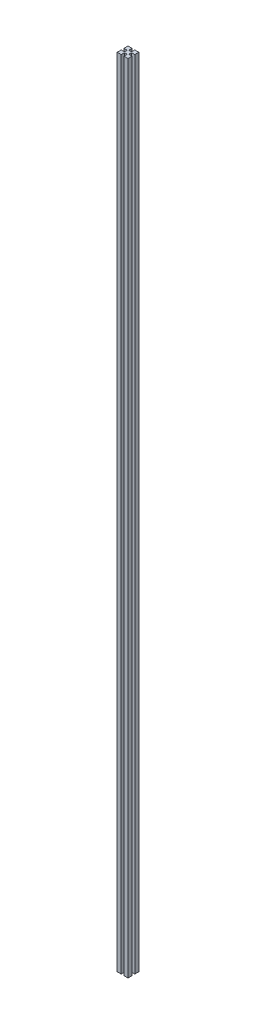
ISO-10303-21;
HEADER;
FILE_DESCRIPTION(('STEP AP214'),'2;1');
FILE_NAME('part.step','',(''),(''),'','','');
FILE_SCHEMA(('AUTOMOTIVE_DESIGN { 1 0 10303 214 1 1 1 1 }'));
ENDSEC;
DATA;
#1=APPLICATION_CONTEXT('core data for automotive mechanical design processes');
#2=APPLICATION_PROTOCOL_DEFINITION('international standard','automotive_design',2000,#1);
#3=PRODUCT_CONTEXT('',#1,'mechanical');
#4=PRODUCT('Part','Part','',(#3));
#5=PRODUCT_RELATED_PRODUCT_CATEGORY('part','',(#4));
#6=PRODUCT_DEFINITION_FORMATION('','',#4);
#7=PRODUCT_DEFINITION_CONTEXT('part definition',#1,'design');
#8=PRODUCT_DEFINITION('design','',#6,#7);
#9=PRODUCT_DEFINITION_SHAPE('','',#8);
#10=(LENGTH_UNIT() NAMED_UNIT(*) SI_UNIT(.MILLI.,.METRE.));
#11=(NAMED_UNIT(*) PLANE_ANGLE_UNIT() SI_UNIT($,.RADIAN.));
#12=(NAMED_UNIT(*) SI_UNIT($,.STERADIAN.) SOLID_ANGLE_UNIT());
#13=UNCERTAINTY_MEASURE_WITH_UNIT(LENGTH_MEASURE(1.E-05),#10,'distance_accuracy_value','');
#14=(GEOMETRIC_REPRESENTATION_CONTEXT(3) GLOBAL_UNCERTAINTY_ASSIGNED_CONTEXT((#13)) GLOBAL_UNIT_ASSIGNED_CONTEXT((#10,
#11,#12)) REPRESENTATION_CONTEXT('',''));
#15=CARTESIAN_POINT('',(0.,0.,0.));
#16=DIRECTION('',(0.,0.,1.));
#17=DIRECTION('',(1.,0.,0.));
#18=AXIS2_PLACEMENT_3D('',#15,#16,#17);
#19=CARTESIAN_POINT('',(10.,-736.6,10.));
#20=DIRECTION('',(1.,0.,0.));
#21=DIRECTION('',(0.,0.,-1.));
#22=AXIS2_PLACEMENT_3D('',#19,#20,#21);
#23=PLANE('',#22);
#24=DIRECTION('',(0.,-1.,0.));
#25=VECTOR('',#24,1.);
#26=CARTESIAN_POINT('',(10.,-736.6,2.5));
#27=LINE('',#26,#25);
#28=CARTESIAN_POINT('',(10.,736.6,2.5));
#29=VERTEX_POINT('',#28);
#30=CARTESIAN_POINT('',(10.,-736.6,2.5));
#31=VERTEX_POINT('',#30);
#32=EDGE_CURVE('E263',#29,#31,#27,.T.);
#33=ORIENTED_EDGE('',*,*,#32,.F.);
#34=DIRECTION('',(0.,0.,-1.));
#35=VECTOR('',#34,1.);
#36=CARTESIAN_POINT('',(10.,736.6,10.));
#37=LINE('',#36,#35);
#38=CARTESIAN_POINT('',(10.,736.6,10.));
#39=VERTEX_POINT('',#38);
#40=EDGE_CURVE('E269',#39,#29,#37,.T.);
#41=ORIENTED_EDGE('',*,*,#40,.F.);
#42=DIRECTION('',(0.,1.,0.));
#43=VECTOR('',#42,1.);
#44=CARTESIAN_POINT('',(10.,-736.6,10.));
#45=LINE('',#44,#43);
#46=CARTESIAN_POINT('',(10.,-736.6,10.));
#47=VERTEX_POINT('',#46);
#48=EDGE_CURVE('E300',#47,#39,#45,.T.);
#49=ORIENTED_EDGE('',*,*,#48,.F.);
#50=DIRECTION('',(0.,0.,-1.));
#51=VECTOR('',#50,1.);
#52=CARTESIAN_POINT('',(10.,-736.6,10.));
#53=LINE('',#52,#51);
#54=EDGE_CURVE('E284',#47,#31,#53,.T.);
#55=ORIENTED_EDGE('',*,*,#54,.T.);
#56=EDGE_LOOP('',(#33,#41,#49,#55));
#57=FACE_BOUND('',#56,.T.);
#58=ADVANCED_FACE('F32',(#57),#23,.T.);
#59=CARTESIAN_POINT('',(-10.,-736.6,10.));
#60=DIRECTION('',(0.,0.,1.));
#61=DIRECTION('',(1.,0.,0.));
#62=AXIS2_PLACEMENT_3D('',#59,#60,#61);
#63=PLANE('',#62);
#64=DIRECTION('',(0.,1.,0.));
#65=VECTOR('',#64,1.);
#66=CARTESIAN_POINT('',(2.50000000000001,-736.6,10.));
#67=LINE('',#66,#65);
#68=CARTESIAN_POINT('',(2.50000000000001,-736.6,10.));
#69=VERTEX_POINT('',#68);
#70=CARTESIAN_POINT('',(2.50000000000001,736.6,10.));
#71=VERTEX_POINT('',#70);
#72=EDGE_CURVE('E256',#69,#71,#67,.T.);
#73=ORIENTED_EDGE('',*,*,#72,.F.);
#74=DIRECTION('',(1.,0.,0.));
#75=VECTOR('',#74,1.);
#76=CARTESIAN_POINT('',(-10.,-736.6,10.));
#77=LINE('',#76,#75);
#78=EDGE_CURVE('E295',#69,#47,#77,.T.);
#79=ORIENTED_EDGE('',*,*,#78,.T.);
#80=ORIENTED_EDGE('',*,*,#48,.T.);
#81=DIRECTION('',(1.,0.,0.));
#82=VECTOR('',#81,1.);
#83=CARTESIAN_POINT('',(-10.,736.6,10.));
#84=LINE('',#83,#82);
#85=EDGE_CURVE('E279',#71,#39,#84,.T.);
#86=ORIENTED_EDGE('',*,*,#85,.F.);
#87=EDGE_LOOP('',(#73,#79,#80,#86));
#88=FACE_BOUND('',#87,.T.);
#89=ADVANCED_FACE('F374',(#88),#63,.T.);
#90=CARTESIAN_POINT('',(-10.,-736.6,10.));
#91=DIRECTION('',(-1.,0.,0.));
#92=DIRECTION('',(0.,0.,1.));
#93=AXIS2_PLACEMENT_3D('',#90,#91,#92);
#94=PLANE('',#93);
#95=DIRECTION('',(0.,-1.,0.));
#96=VECTOR('',#95,1.);
#97=CARTESIAN_POINT('',(-10.,-736.6,-2.50000000000001));
#98=LINE('',#97,#96);
#99=CARTESIAN_POINT('',(-10.,736.6,-2.50000000000001));
#100=VERTEX_POINT('',#99);
#101=CARTESIAN_POINT('',(-10.,-736.6,-2.50000000000001));
#102=VERTEX_POINT('',#101);
#103=EDGE_CURVE('E259',#100,#102,#98,.T.);
#104=ORIENTED_EDGE('',*,*,#103,.F.);
#105=DIRECTION('',(0.,0.,1.));
#106=VECTOR('',#105,1.);
#107=CARTESIAN_POINT('',(-10.,736.6,10.));
#108=LINE('',#107,#106);
#109=CARTESIAN_POINT('',(-10.,736.6,-10.));
#110=VERTEX_POINT('',#109);
#111=EDGE_CURVE('E276',#110,#100,#108,.T.);
#112=ORIENTED_EDGE('',*,*,#111,.F.);
#113=DIRECTION('',(0.,1.,0.));
#114=VECTOR('',#113,1.);
#115=CARTESIAN_POINT('',(-10.,-736.6,-10.));
#116=LINE('',#115,#114);
#117=CARTESIAN_POINT('',(-10.,-736.6,-10.));
#118=VERTEX_POINT('',#117);
#119=EDGE_CURVE('E307',#118,#110,#116,.T.);
#120=ORIENTED_EDGE('',*,*,#119,.F.);
#121=DIRECTION('',(0.,0.,1.));
#122=VECTOR('',#121,1.);
#123=CARTESIAN_POINT('',(-10.,-736.6,10.));
#124=LINE('',#123,#122);
#125=EDGE_CURVE('E292',#118,#102,#124,.T.);
#126=ORIENTED_EDGE('',*,*,#125,.T.);
#127=EDGE_LOOP('',(#104,#112,#120,#126));
#128=FACE_BOUND('',#127,.T.);
#129=ADVANCED_FACE('F344',(#128),#94,.T.);
#130=CARTESIAN_POINT('',(-10.,-736.6,-10.));
#131=DIRECTION('',(0.,0.,-1.));
#132=DIRECTION('',(-1.,0.,0.));
#133=AXIS2_PLACEMENT_3D('',#130,#131,#132);
#134=PLANE('',#133);
#135=DIRECTION('',(0.,-1.,0.));
#136=VECTOR('',#135,1.);
#137=CARTESIAN_POINT('',(2.5,-736.6,-10.));
#138=LINE('',#137,#136);
#139=CARTESIAN_POINT('',(2.5,736.6,-10.));
#140=VERTEX_POINT('',#139);
#141=CARTESIAN_POINT('',(2.5,-736.6,-10.));
#142=VERTEX_POINT('',#141);
#143=EDGE_CURVE('E266',#140,#142,#138,.T.);
#144=ORIENTED_EDGE('',*,*,#143,.F.);
#145=DIRECTION('',(-1.,0.,0.));
#146=VECTOR('',#145,1.);
#147=CARTESIAN_POINT('',(-10.,736.6,-10.));
#148=LINE('',#147,#146);
#149=CARTESIAN_POINT('',(10.,736.6,-10.));
#150=VERTEX_POINT('',#149);
#151=EDGE_CURVE('E273',#150,#140,#148,.T.);
#152=ORIENTED_EDGE('',*,*,#151,.F.);
#153=DIRECTION('',(0.,1.,0.));
#154=VECTOR('',#153,1.);
#155=CARTESIAN_POINT('',(10.,-736.6,-10.));
#156=LINE('',#155,#154);
#157=CARTESIAN_POINT('',(10.,-736.6,-10.));
#158=VERTEX_POINT('',#157);
#159=EDGE_CURVE('E299',#158,#150,#156,.T.);
#160=ORIENTED_EDGE('',*,*,#159,.F.);
#161=DIRECTION('',(-1.,0.,0.));
#162=VECTOR('',#161,1.);
#163=CARTESIAN_POINT('',(-10.,-736.6,-10.));
#164=LINE('',#163,#162);
#165=EDGE_CURVE('E288',#158,#142,#164,.T.);
#166=ORIENTED_EDGE('',*,*,#165,.T.);
#167=EDGE_LOOP('',(#144,#152,#160,#166));
#168=FACE_BOUND('',#167,.T.);
#169=ADVANCED_FACE('F328',(#168),#134,.T.);
#170=DIRECTION('',(0.,1.,0.));
#171=VECTOR('',#170,1.);
#172=CARTESIAN_POINT('',(10.,-736.6,-2.5));
#173=LINE('',#172,#171);
#174=CARTESIAN_POINT('',(10.,-736.6,-2.5));
#175=VERTEX_POINT('',#174);
#176=CARTESIAN_POINT('',(10.,736.6,-2.5));
#177=VERTEX_POINT('',#176);
#178=EDGE_CURVE('E261',#175,#177,#173,.T.);
#179=ORIENTED_EDGE('',*,*,#178,.F.);
#180=EDGE_CURVE('E283',#175,#158,#53,.T.);
#181=ORIENTED_EDGE('',*,*,#180,.T.);
#182=ORIENTED_EDGE('',*,*,#159,.T.);
#183=EDGE_CURVE('E268',#177,#150,#37,.T.);
#184=ORIENTED_EDGE('',*,*,#183,.F.);
#185=EDGE_LOOP('',(#179,#181,#182,#184));
#186=FACE_BOUND('',#185,.T.);
#187=ADVANCED_FACE('F34',(#186),#23,.T.);
#188=DIRECTION('',(0.,-1.,0.));
#189=VECTOR('',#188,1.);
#190=CARTESIAN_POINT('',(-2.49999999999999,-736.6,10.));
#191=LINE('',#190,#189);
#192=CARTESIAN_POINT('',(-2.49999999999999,736.6,10.));
#193=VERTEX_POINT('',#192);
#194=CARTESIAN_POINT('',(-2.49999999999999,-736.6,10.));
#195=VERTEX_POINT('',#194);
#196=EDGE_CURVE('E200',#193,#195,#191,.T.);
#197=ORIENTED_EDGE('',*,*,#196,.F.);
#198=CARTESIAN_POINT('',(-10.,736.6,10.));
#199=VERTEX_POINT('',#198);
#200=EDGE_CURVE('E280',#199,#193,#84,.T.);
#201=ORIENTED_EDGE('',*,*,#200,.F.);
#202=DIRECTION('',(0.,1.,0.));
#203=VECTOR('',#202,1.);
#204=CARTESIAN_POINT('',(-10.,-736.6,10.));
#205=LINE('',#204,#203);
#206=CARTESIAN_POINT('',(-10.,-736.6,10.));
#207=VERTEX_POINT('',#206);
#208=EDGE_CURVE('E304',#207,#199,#205,.T.);
#209=ORIENTED_EDGE('',*,*,#208,.F.);
#210=EDGE_CURVE('E296',#207,#195,#77,.T.);
#211=ORIENTED_EDGE('',*,*,#210,.T.);
#212=EDGE_LOOP('',(#197,#201,#209,#211));
#213=FACE_BOUND('',#212,.T.);
#214=ADVANCED_FACE('F360',(#213),#63,.T.);
#215=DIRECTION('',(0.,1.,0.));
#216=VECTOR('',#215,1.);
#217=CARTESIAN_POINT('',(-10.,-736.6,2.49999999999999));
#218=LINE('',#217,#216);
#219=CARTESIAN_POINT('',(-10.,-736.6,2.49999999999999));
#220=VERTEX_POINT('',#219);
#221=CARTESIAN_POINT('',(-10.,736.6,2.49999999999999));
#222=VERTEX_POINT('',#221);
#223=EDGE_CURVE('E55',#220,#222,#218,.T.);
#224=ORIENTED_EDGE('',*,*,#223,.F.);
#225=EDGE_CURVE('E291',#220,#207,#124,.T.);
#226=ORIENTED_EDGE('',*,*,#225,.T.);
#227=ORIENTED_EDGE('',*,*,#208,.T.);
#228=EDGE_CURVE('E275',#222,#199,#108,.T.);
#229=ORIENTED_EDGE('',*,*,#228,.F.);
#230=EDGE_LOOP('',(#224,#226,#227,#229));
#231=FACE_BOUND('',#230,.T.);
#232=ADVANCED_FACE('F354',(#231),#94,.T.);
#233=DIRECTION('',(0.,1.,0.));
#234=VECTOR('',#233,1.);
#235=CARTESIAN_POINT('',(-2.5,-736.6,-10.));
#236=LINE('',#235,#234);
#237=CARTESIAN_POINT('',(-2.5,-736.6,-10.));
#238=VERTEX_POINT('',#237);
#239=CARTESIAN_POINT('',(-2.5,736.6,-10.));
#240=VERTEX_POINT('',#239);
#241=EDGE_CURVE('E173',#238,#240,#236,.T.);
#242=ORIENTED_EDGE('',*,*,#241,.F.);
#243=EDGE_CURVE('E287',#238,#118,#164,.T.);
#244=ORIENTED_EDGE('',*,*,#243,.T.);
#245=ORIENTED_EDGE('',*,*,#119,.T.);
#246=EDGE_CURVE('E272',#240,#110,#148,.T.);
#247=ORIENTED_EDGE('',*,*,#246,.F.);
#248=EDGE_LOOP('',(#242,#244,#245,#247));
#249=FACE_BOUND('',#248,.T.);
#250=ADVANCED_FACE('F337',(#249),#134,.T.);
#251=CARTESIAN_POINT('',(0.,-736.6,0.));
#252=DIRECTION('',(0.,-1.,0.));
#253=DIRECTION('',(0.,0.,-1.));
#254=AXIS2_PLACEMENT_3D('',#251,#252,#253);
#255=PLANE('',#254);
#256=DIRECTION('',(0.,0.,-1.));
#257=VECTOR('',#256,1.);
#258=CARTESIAN_POINT('',(2.5,-736.6,-4.));
#259=LINE('',#258,#257);
#260=CARTESIAN_POINT('',(2.5,-736.6,-4.));
#261=VERTEX_POINT('',#260);
#262=EDGE_CURVE('E190',#261,#142,#259,.T.);
#263=ORIENTED_EDGE('',*,*,#262,.T.);
#264=ORIENTED_EDGE('',*,*,#165,.F.);
#265=ORIENTED_EDGE('',*,*,#180,.F.);
#266=DIRECTION('',(-1.,0.,0.));
#267=VECTOR('',#266,1.);
#268=CARTESIAN_POINT('',(4.,-736.6,-2.5));
#269=LINE('',#268,#267);
#270=CARTESIAN_POINT('',(4.,-736.6,-2.5));
#271=VERTEX_POINT('',#270);
#272=EDGE_CURVE('E208',#175,#271,#269,.T.);
#273=ORIENTED_EDGE('',*,*,#272,.T.);
#274=DIRECTION('',(0.,0.,1.));
#275=VECTOR('',#274,1.);
#276=CARTESIAN_POINT('',(4.,-736.6,-2.5));
#277=LINE('',#276,#275);
#278=CARTESIAN_POINT('',(4.,-736.6,2.5));
#279=VERTEX_POINT('',#278);
#280=EDGE_CURVE('E211',#271,#279,#277,.T.);
#281=ORIENTED_EDGE('',*,*,#280,.T.);
#282=DIRECTION('',(1.,0.,0.));
#283=VECTOR('',#282,1.);
#284=CARTESIAN_POINT('',(4.,-736.6,2.5));
#285=LINE('',#284,#283);
#286=EDGE_CURVE('E214',#279,#31,#285,.T.);
#287=ORIENTED_EDGE('',*,*,#286,.T.);
#288=ORIENTED_EDGE('',*,*,#54,.F.);
#289=ORIENTED_EDGE('',*,*,#78,.F.);
#290=DIRECTION('',(0.,0.,-1.));
#291=VECTOR('',#290,1.);
#292=CARTESIAN_POINT('',(2.5,-736.6,4.));
#293=LINE('',#292,#291);
#294=CARTESIAN_POINT('',(2.5,-736.6,4.));
#295=VERTEX_POINT('',#294);
#296=EDGE_CURVE('E249',#69,#295,#293,.T.);
#297=ORIENTED_EDGE('',*,*,#296,.T.);
#298=DIRECTION('',(-1.,0.,0.));
#299=VECTOR('',#298,1.);
#300=CARTESIAN_POINT('',(-2.49999999999999,-736.6,3.99999999999999));
#301=LINE('',#300,#299);
#302=CARTESIAN_POINT('',(-2.49999999999999,-736.6,3.99999999999999));
#303=VERTEX_POINT('',#302);
#304=EDGE_CURVE('E243',#295,#303,#301,.T.);
#305=ORIENTED_EDGE('',*,*,#304,.T.);
#306=DIRECTION('',(0.,0.,1.));
#307=VECTOR('',#306,1.);
#308=CARTESIAN_POINT('',(-2.49999999999999,-736.6,3.99999999999999));
#309=LINE('',#308,#307);
#310=EDGE_CURVE('E246',#303,#195,#309,.T.);
#311=ORIENTED_EDGE('',*,*,#310,.T.);
#312=ORIENTED_EDGE('',*,*,#210,.F.);
#313=ORIENTED_EDGE('',*,*,#225,.F.);
#314=DIRECTION('',(1.,0.,0.));
#315=VECTOR('',#314,1.);
#316=CARTESIAN_POINT('',(-3.99999999999999,-736.6,2.49999999999999));
#317=LINE('',#316,#315);
#318=CARTESIAN_POINT('',(-3.99999999999999,-736.6,2.49999999999999));
#319=VERTEX_POINT('',#318);
#320=EDGE_CURVE('E230',#220,#319,#317,.T.);
#321=ORIENTED_EDGE('',*,*,#320,.T.);
#322=DIRECTION('',(0.,0.,-1.));
#323=VECTOR('',#322,1.);
#324=CARTESIAN_POINT('',(-4.,-736.6,-2.50000000000001));
#325=LINE('',#324,#323);
#326=CARTESIAN_POINT('',(-4.,-736.6,-2.50000000000001));
#327=VERTEX_POINT('',#326);
#328=EDGE_CURVE('E233',#319,#327,#325,.T.);
#329=ORIENTED_EDGE('',*,*,#328,.T.);
#330=DIRECTION('',(-1.,0.,0.));
#331=VECTOR('',#330,1.);
#332=CARTESIAN_POINT('',(-4.,-736.6,-2.50000000000001));
#333=LINE('',#332,#331);
#334=EDGE_CURVE('E227',#327,#102,#333,.T.);
#335=ORIENTED_EDGE('',*,*,#334,.T.);
#336=ORIENTED_EDGE('',*,*,#125,.F.);
#337=ORIENTED_EDGE('',*,*,#243,.F.);
#338=DIRECTION('',(0.,0.,1.));
#339=VECTOR('',#338,1.);
#340=CARTESIAN_POINT('',(-2.5,-736.6,-4.));
#341=LINE('',#340,#339);
#342=CARTESIAN_POINT('',(-2.5,-736.6,-4.));
#343=VERTEX_POINT('',#342);
#344=EDGE_CURVE('E193',#238,#343,#341,.T.);
#345=ORIENTED_EDGE('',*,*,#344,.T.);
#346=DIRECTION('',(1.,0.,0.));
#347=VECTOR('',#346,1.);
#348=CARTESIAN_POINT('',(-2.5,-736.6,-4.));
#349=LINE('',#348,#347);
#350=EDGE_CURVE('E183',#343,#261,#349,.T.);
#351=ORIENTED_EDGE('',*,*,#350,.T.);
#352=EDGE_LOOP('',(#263,#264,#265,#273,#281,#287,#288,#289,#297,#305,#311,#312,#313,#321,#329,
#335,#336,#337,#345,#351));
#353=FACE_BOUND('',#352,.T.);
#354=ADVANCED_FACE('F333',(#353),#255,.T.);
#355=CARTESIAN_POINT('',(0.,736.6,0.));
#356=DIRECTION('',(0.,-1.,0.));
#357=DIRECTION('',(0.,0.,-1.));
#358=AXIS2_PLACEMENT_3D('',#355,#356,#357);
#359=PLANE('',#358);
#360=ORIENTED_EDGE('',*,*,#151,.T.);
#361=DIRECTION('',(0.,0.,-1.));
#362=VECTOR('',#361,1.);
#363=CARTESIAN_POINT('',(2.5,736.6,-4.));
#364=LINE('',#363,#362);
#365=CARTESIAN_POINT('',(2.5,736.6,-4.));
#366=VERTEX_POINT('',#365);
#367=EDGE_CURVE('E189',#366,#140,#364,.T.);
#368=ORIENTED_EDGE('',*,*,#367,.F.);
#369=DIRECTION('',(1.,0.,0.));
#370=VECTOR('',#369,1.);
#371=CARTESIAN_POINT('',(-2.5,736.6,-4.));
#372=LINE('',#371,#370);
#373=CARTESIAN_POINT('',(-2.5,736.6,-4.));
#374=VERTEX_POINT('',#373);
#375=EDGE_CURVE('E180',#374,#366,#372,.T.);
#376=ORIENTED_EDGE('',*,*,#375,.F.);
#377=DIRECTION('',(0.,0.,-1.));
#378=VECTOR('',#377,1.);
#379=CARTESIAN_POINT('',(-2.5,736.6,0.));
#380=LINE('',#379,#378);
#381=EDGE_CURVE('E11',#374,#240,#380,.T.);
#382=ORIENTED_EDGE('',*,*,#381,.T.);
#383=ORIENTED_EDGE('',*,*,#246,.T.);
#384=ORIENTED_EDGE('',*,*,#111,.T.);
#385=DIRECTION('',(-1.,0.,0.));
#386=VECTOR('',#385,1.);
#387=CARTESIAN_POINT('',(-4.,736.6,-2.50000000000001));
#388=LINE('',#387,#386);
#389=CARTESIAN_POINT('',(-4.,736.6,-2.50000000000001));
#390=VERTEX_POINT('',#389);
#391=EDGE_CURVE('E221',#390,#100,#388,.T.);
#392=ORIENTED_EDGE('',*,*,#391,.F.);
#393=DIRECTION('',(0.,0.,-1.));
#394=VECTOR('',#393,1.);
#395=CARTESIAN_POINT('',(-4.,736.6,-2.50000000000001));
#396=LINE('',#395,#394);
#397=CARTESIAN_POINT('',(-3.99999999999999,736.6,2.49999999999999));
#398=VERTEX_POINT('',#397);
#399=EDGE_CURVE('E223',#398,#390,#396,.T.);
#400=ORIENTED_EDGE('',*,*,#399,.F.);
#401=DIRECTION('',(-1.,0.,0.));
#402=VECTOR('',#401,1.);
#403=CARTESIAN_POINT('',(0.,736.6,2.49999999999999));
#404=LINE('',#403,#402);
#405=EDGE_CURVE('E314',#398,#222,#404,.T.);
#406=ORIENTED_EDGE('',*,*,#405,.T.);
#407=ORIENTED_EDGE('',*,*,#228,.T.);
#408=ORIENTED_EDGE('',*,*,#200,.T.);
#409=DIRECTION('',(0.,0.,1.));
#410=VECTOR('',#409,1.);
#411=CARTESIAN_POINT('',(-2.49999999999999,736.6,3.99999999999999));
#412=LINE('',#411,#410);
#413=CARTESIAN_POINT('',(-2.49999999999999,736.6,3.99999999999999));
#414=VERTEX_POINT('',#413);
#415=EDGE_CURVE('E241',#414,#193,#412,.T.);
#416=ORIENTED_EDGE('',*,*,#415,.F.);
#417=DIRECTION('',(-1.,0.,0.));
#418=VECTOR('',#417,1.);
#419=CARTESIAN_POINT('',(-2.49999999999999,736.6,3.99999999999999));
#420=LINE('',#419,#418);
#421=CARTESIAN_POINT('',(2.5,736.6,4.));
#422=VERTEX_POINT('',#421);
#423=EDGE_CURVE('E47',#422,#414,#420,.T.);
#424=ORIENTED_EDGE('',*,*,#423,.F.);
#425=DIRECTION('',(0.,0.,1.));
#426=VECTOR('',#425,1.);
#427=CARTESIAN_POINT('',(2.5,736.6,0.));
#428=LINE('',#427,#426);
#429=EDGE_CURVE('E303',#422,#71,#428,.T.);
#430=ORIENTED_EDGE('',*,*,#429,.T.);
#431=ORIENTED_EDGE('',*,*,#85,.T.);
#432=ORIENTED_EDGE('',*,*,#40,.T.);
#433=DIRECTION('',(1.,0.,0.));
#434=VECTOR('',#433,1.);
#435=CARTESIAN_POINT('',(4.,736.6,2.5));
#436=LINE('',#435,#434);
#437=CARTESIAN_POINT('',(4.,736.6,2.5));
#438=VERTEX_POINT('',#437);
#439=EDGE_CURVE('E205',#438,#29,#436,.T.);
#440=ORIENTED_EDGE('',*,*,#439,.F.);
#441=DIRECTION('',(0.,0.,1.));
#442=VECTOR('',#441,1.);
#443=CARTESIAN_POINT('',(4.,736.6,-2.5));
#444=LINE('',#443,#442);
#445=CARTESIAN_POINT('',(4.,736.6,-2.5));
#446=VERTEX_POINT('',#445);
#447=EDGE_CURVE('E202',#446,#438,#444,.T.);
#448=ORIENTED_EDGE('',*,*,#447,.F.);
#449=DIRECTION('',(1.,0.,0.));
#450=VECTOR('',#449,1.);
#451=CARTESIAN_POINT('',(0.,736.6,-2.5));
#452=LINE('',#451,#450);
#453=EDGE_CURVE('E40',#446,#177,#452,.T.);
#454=ORIENTED_EDGE('',*,*,#453,.T.);
#455=ORIENTED_EDGE('',*,*,#183,.T.);
#456=EDGE_LOOP('',(#360,#368,#376,#382,#383,#384,#392,#400,#406,#407,#408,#416,#424,#430,#431,
#432,#440,#448,#454,#455));
#457=FACE_BOUND('',#456,.T.);
#458=ADVANCED_FACE('F188',(#457),#359,.F.);
#459=CARTESIAN_POINT('',(-2.49999999999999,-736.6,3.99999999999999));
#460=DIRECTION('',(0.,0.,-1.));
#461=DIRECTION('',(-1.,0.,0.));
#462=AXIS2_PLACEMENT_3D('',#459,#460,#461);
#463=PLANE('',#462);
#464=DIRECTION('',(0.,1.,0.));
#465=VECTOR('',#464,1.);
#466=CARTESIAN_POINT('',(-2.49999999999999,-736.6,3.99999999999999));
#467=LINE('',#466,#465);
#468=EDGE_CURVE('E252',#303,#414,#467,.T.);
#469=ORIENTED_EDGE('',*,*,#468,.F.);
#470=ORIENTED_EDGE('',*,*,#304,.F.);
#471=DIRECTION('',(0.,1.,0.));
#472=VECTOR('',#471,1.);
#473=CARTESIAN_POINT('',(2.5,-736.6,4.));
#474=LINE('',#473,#472);
#475=EDGE_CURVE('E224',#295,#422,#474,.T.);
#476=ORIENTED_EDGE('',*,*,#475,.T.);
#477=ORIENTED_EDGE('',*,*,#423,.T.);
#478=EDGE_LOOP('',(#469,#470,#476,#477));
#479=FACE_BOUND('',#478,.T.);
#480=ADVANCED_FACE('F366',(#479),#463,.F.);
#481=CARTESIAN_POINT('',(2.5,-736.6,4.));
#482=DIRECTION('',(1.,0.,0.));
#483=DIRECTION('',(0.,0.,-1.));
#484=AXIS2_PLACEMENT_3D('',#481,#482,#483);
#485=PLANE('',#484);
#486=ORIENTED_EDGE('',*,*,#72,.T.);
#487=ORIENTED_EDGE('',*,*,#429,.F.);
#488=ORIENTED_EDGE('',*,*,#475,.F.);
#489=ORIENTED_EDGE('',*,*,#296,.F.);
#490=EDGE_LOOP('',(#486,#487,#488,#489));
#491=FACE_BOUND('',#490,.T.);
#492=ADVANCED_FACE('F371',(#491),#485,.F.);
#493=CARTESIAN_POINT('',(-2.49999999999999,-736.6,3.99999999999999));
#494=DIRECTION('',(-1.,0.,0.));
#495=DIRECTION('',(0.,0.,1.));
#496=AXIS2_PLACEMENT_3D('',#493,#494,#495);
#497=PLANE('',#496);
#498=ORIENTED_EDGE('',*,*,#196,.T.);
#499=ORIENTED_EDGE('',*,*,#310,.F.);
#500=ORIENTED_EDGE('',*,*,#468,.T.);
#501=ORIENTED_EDGE('',*,*,#415,.T.);
#502=EDGE_LOOP('',(#498,#499,#500,#501));
#503=FACE_BOUND('',#502,.T.);
#504=ADVANCED_FACE('F363',(#503),#497,.F.);
#505=CARTESIAN_POINT('',(-4.,-736.6,-2.50000000000001));
#506=DIRECTION('',(0.,0.,-1.));
#507=DIRECTION('',(-1.,0.,0.));
#508=AXIS2_PLACEMENT_3D('',#505,#506,#507);
#509=PLANE('',#508);
#510=ORIENTED_EDGE('',*,*,#103,.T.);
#511=ORIENTED_EDGE('',*,*,#334,.F.);
#512=DIRECTION('',(0.,1.,0.));
#513=VECTOR('',#512,1.);
#514=CARTESIAN_POINT('',(-4.,-736.6,-2.50000000000001));
#515=LINE('',#514,#513);
#516=EDGE_CURVE('E206',#327,#390,#515,.T.);
#517=ORIENTED_EDGE('',*,*,#516,.T.);
#518=ORIENTED_EDGE('',*,*,#391,.T.);
#519=EDGE_LOOP('',(#510,#511,#517,#518));
#520=FACE_BOUND('',#519,.T.);
#521=ADVANCED_FACE('F347',(#520),#509,.F.);
#522=CARTESIAN_POINT('',(-4.,-736.6,-2.50000000000001));
#523=DIRECTION('',(1.,0.,0.));
#524=DIRECTION('',(0.,0.,-1.));
#525=AXIS2_PLACEMENT_3D('',#522,#523,#524);
#526=PLANE('',#525);
#527=ORIENTED_EDGE('',*,*,#516,.F.);
#528=ORIENTED_EDGE('',*,*,#328,.F.);
#529=DIRECTION('',(0.,1.,0.));
#530=VECTOR('',#529,1.);
#531=CARTESIAN_POINT('',(-3.99999999999999,-736.6,2.49999999999999));
#532=LINE('',#531,#530);
#533=EDGE_CURVE('E236',#319,#398,#532,.T.);
#534=ORIENTED_EDGE('',*,*,#533,.T.);
#535=ORIENTED_EDGE('',*,*,#399,.T.);
#536=EDGE_LOOP('',(#527,#528,#534,#535));
#537=FACE_BOUND('',#536,.T.);
#538=ADVANCED_FACE('F351',(#537),#526,.F.);
#539=CARTESIAN_POINT('',(-3.99999999999999,-736.6,2.49999999999999));
#540=DIRECTION('',(0.,0.,1.));
#541=DIRECTION('',(1.,0.,0.));
#542=AXIS2_PLACEMENT_3D('',#539,#540,#541);
#543=PLANE('',#542);
#544=ORIENTED_EDGE('',*,*,#223,.T.);
#545=ORIENTED_EDGE('',*,*,#405,.F.);
#546=ORIENTED_EDGE('',*,*,#533,.F.);
#547=ORIENTED_EDGE('',*,*,#320,.F.);
#548=EDGE_LOOP('',(#544,#545,#546,#547));
#549=FACE_BOUND('',#548,.T.);
#550=ADVANCED_FACE('F428',(#549),#543,.F.);
#551=CARTESIAN_POINT('',(4.,-736.6,2.5));
#552=DIRECTION('',(0.,0.,1.));
#553=DIRECTION('',(1.,0.,0.));
#554=AXIS2_PLACEMENT_3D('',#551,#552,#553);
#555=PLANE('',#554);
#556=ORIENTED_EDGE('',*,*,#32,.T.);
#557=ORIENTED_EDGE('',*,*,#286,.F.);
#558=DIRECTION('',(0.,1.,0.));
#559=VECTOR('',#558,1.);
#560=CARTESIAN_POINT('',(4.,-736.6,2.5));
#561=LINE('',#560,#559);
#562=EDGE_CURVE('E195',#279,#438,#561,.T.);
#563=ORIENTED_EDGE('',*,*,#562,.T.);
#564=ORIENTED_EDGE('',*,*,#439,.T.);
#565=EDGE_LOOP('',(#556,#557,#563,#564));
#566=FACE_BOUND('',#565,.T.);
#567=ADVANCED_FACE('F381',(#566),#555,.F.);
#568=CARTESIAN_POINT('',(4.,-736.6,-2.5));
#569=DIRECTION('',(-1.,0.,0.));
#570=DIRECTION('',(0.,0.,1.));
#571=AXIS2_PLACEMENT_3D('',#568,#569,#570);
#572=PLANE('',#571);
#573=ORIENTED_EDGE('',*,*,#562,.F.);
#574=ORIENTED_EDGE('',*,*,#280,.F.);
#575=DIRECTION('',(0.,1.,0.));
#576=VECTOR('',#575,1.);
#577=CARTESIAN_POINT('',(4.,-736.6,-2.5));
#578=LINE('',#577,#576);
#579=EDGE_CURVE('E217',#271,#446,#578,.T.);
#580=ORIENTED_EDGE('',*,*,#579,.T.);
#581=ORIENTED_EDGE('',*,*,#447,.T.);
#582=EDGE_LOOP('',(#573,#574,#580,#581));
#583=FACE_BOUND('',#582,.T.);
#584=ADVANCED_FACE('F384',(#583),#572,.F.);
#585=CARTESIAN_POINT('',(4.,-736.6,-2.5));
#586=DIRECTION('',(0.,0.,-1.));
#587=DIRECTION('',(-1.,0.,0.));
#588=AXIS2_PLACEMENT_3D('',#585,#586,#587);
#589=PLANE('',#588);
#590=ORIENTED_EDGE('',*,*,#178,.T.);
#591=ORIENTED_EDGE('',*,*,#453,.F.);
#592=ORIENTED_EDGE('',*,*,#579,.F.);
#593=ORIENTED_EDGE('',*,*,#272,.F.);
#594=EDGE_LOOP('',(#590,#591,#592,#593));
#595=FACE_BOUND('',#594,.T.);
#596=ADVANCED_FACE('F385',(#595),#589,.F.);
#597=CARTESIAN_POINT('',(2.5,-736.6,-4.));
#598=DIRECTION('',(1.,0.,0.));
#599=DIRECTION('',(0.,0.,-1.));
#600=AXIS2_PLACEMENT_3D('',#597,#598,#599);
#601=PLANE('',#600);
#602=ORIENTED_EDGE('',*,*,#143,.T.);
#603=ORIENTED_EDGE('',*,*,#262,.F.);
#604=DIRECTION('',(0.,1.,0.));
#605=VECTOR('',#604,1.);
#606=CARTESIAN_POINT('',(2.5,-736.6,-4.));
#607=LINE('',#606,#605);
#608=EDGE_CURVE('E185',#261,#366,#607,.T.);
#609=ORIENTED_EDGE('',*,*,#608,.T.);
#610=ORIENTED_EDGE('',*,*,#367,.T.);
#611=EDGE_LOOP('',(#602,#603,#609,#610));
#612=FACE_BOUND('',#611,.T.);
#613=ADVANCED_FACE('F331',(#612),#601,.F.);
#614=CARTESIAN_POINT('',(-2.5,-736.6,-4.));
#615=DIRECTION('',(0.,0.,1.));
#616=DIRECTION('',(1.,0.,0.));
#617=AXIS2_PLACEMENT_3D('',#614,#615,#616);
#618=PLANE('',#617);
#619=ORIENTED_EDGE('',*,*,#608,.F.);
#620=ORIENTED_EDGE('',*,*,#350,.F.);
#621=DIRECTION('',(0.,1.,0.));
#622=VECTOR('',#621,1.);
#623=CARTESIAN_POINT('',(-2.5,-736.6,-4.));
#624=LINE('',#623,#622);
#625=EDGE_CURVE('E170',#343,#374,#624,.T.);
#626=ORIENTED_EDGE('',*,*,#625,.T.);
#627=ORIENTED_EDGE('',*,*,#375,.T.);
#628=EDGE_LOOP('',(#619,#620,#626,#627));
#629=FACE_BOUND('',#628,.T.);
#630=ADVANCED_FACE('F179',(#629),#618,.F.);
#631=CARTESIAN_POINT('',(-2.5,-736.6,-4.));
#632=DIRECTION('',(-1.,0.,0.));
#633=DIRECTION('',(0.,0.,1.));
#634=AXIS2_PLACEMENT_3D('',#631,#632,#633);
#635=PLANE('',#634);
#636=ORIENTED_EDGE('',*,*,#241,.T.);
#637=ORIENTED_EDGE('',*,*,#381,.F.);
#638=ORIENTED_EDGE('',*,*,#625,.F.);
#639=ORIENTED_EDGE('',*,*,#344,.F.);
#640=EDGE_LOOP('',(#636,#637,#638,#639));
#641=FACE_BOUND('',#640,.T.);
#642=ADVANCED_FACE('F169',(#641),#635,.F.);
#643=CLOSED_SHELL('',(#58,#89,#129,#169,#187,#214,#232,#250,#354,#458,#480,#492,#504,#521,#538,
#550,#567,#584,#596,#613,#630,#642));
#644=MANIFOLD_SOLID_BREP('B2',#643);
#645=ADVANCED_BREP_SHAPE_REPRESENTATION('',(#18,#644),#14);
#646=SHAPE_DEFINITION_REPRESENTATION(#9,#645);
ENDSEC;
END-ISO-10303-21;
